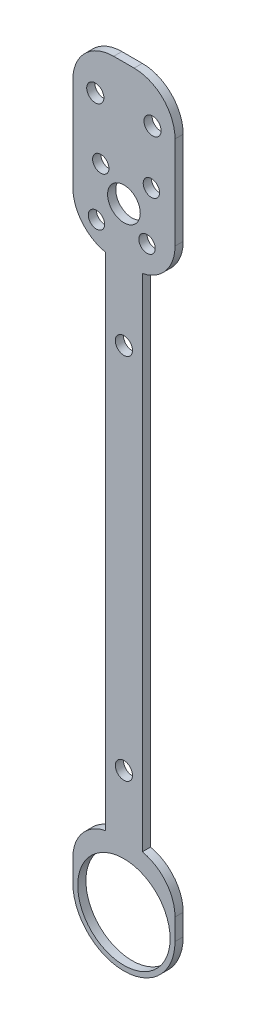
ISO-10303-21;
HEADER;
FILE_DESCRIPTION(('STEP AP214'),'2;1');
FILE_NAME('part.step','',(''),(''),'','','');
FILE_SCHEMA(('AUTOMOTIVE_DESIGN { 1 0 10303 214 1 1 1 1 }'));
ENDSEC;
DATA;
#1=APPLICATION_CONTEXT('core data for automotive mechanical design processes');
#2=APPLICATION_PROTOCOL_DEFINITION('international standard','automotive_design',2000,#1);
#3=PRODUCT_CONTEXT('',#1,'mechanical');
#4=PRODUCT('Part','Part','',(#3));
#5=PRODUCT_RELATED_PRODUCT_CATEGORY('part','',(#4));
#6=PRODUCT_DEFINITION_FORMATION('','',#4);
#7=PRODUCT_DEFINITION_CONTEXT('part definition',#1,'design');
#8=PRODUCT_DEFINITION('design','',#6,#7);
#9=PRODUCT_DEFINITION_SHAPE('','',#8);
#10=(LENGTH_UNIT() NAMED_UNIT(*) SI_UNIT(.MILLI.,.METRE.));
#11=(NAMED_UNIT(*) PLANE_ANGLE_UNIT() SI_UNIT($,.RADIAN.));
#12=(NAMED_UNIT(*) SI_UNIT($,.STERADIAN.) SOLID_ANGLE_UNIT());
#13=UNCERTAINTY_MEASURE_WITH_UNIT(LENGTH_MEASURE(1.E-05),#10,'distance_accuracy_value','');
#14=(GEOMETRIC_REPRESENTATION_CONTEXT(3) GLOBAL_UNCERTAINTY_ASSIGNED_CONTEXT((#13)) GLOBAL_UNIT_ASSIGNED_CONTEXT((#10,
#11,#12)) REPRESENTATION_CONTEXT('',''));
#15=CARTESIAN_POINT('',(0.,0.,0.));
#16=DIRECTION('',(0.,0.,1.));
#17=DIRECTION('',(1.,0.,0.));
#18=AXIS2_PLACEMENT_3D('',#15,#16,#17);
#19=CARTESIAN_POINT('',(0.,0.,2.));
#20=DIRECTION('',(0.,0.,1.));
#21=DIRECTION('',(1.,0.,0.));
#22=AXIS2_PLACEMENT_3D('',#19,#20,#21);
#23=PLANE('',#22);
#24=CARTESIAN_POINT('',(19.2175144212722,156.717514421272,2.));
#25=DIRECTION('',(0.,0.,1.));
#26=DIRECTION('',(1.,0.,0.));
#27=AXIS2_PLACEMENT_3D('',#24,#25,#26);
#28=CIRCLE('',#27,2.);
#29=CARTESIAN_POINT('',(21.2175144212722,156.717514421272,2.));
#30=VERTEX_POINT('',#29);
#31=EDGE_CURVE('E251',#30,#30,#28,.T.);
#32=ORIENTED_EDGE('',*,*,#31,.F.);
#33=EDGE_LOOP('',(#32));
#34=FACE_BOUND('',#33,.T.);
#35=CARTESIAN_POINT('',(6.84314575050766,155.656854249492,2.));
#36=DIRECTION('',(0.,0.,1.));
#37=DIRECTION('',(1.,0.,0.));
#38=AXIS2_PLACEMENT_3D('',#35,#36,#37);
#39=CIRCLE('',#38,2.);
#40=CARTESIAN_POINT('',(8.84314575050766,155.656854249492,2.));
#41=VERTEX_POINT('',#40);
#42=EDGE_CURVE('E282',#41,#41,#39,.T.);
#43=ORIENTED_EDGE('',*,*,#42,.F.);
#44=EDGE_LOOP('',(#43));
#45=FACE_BOUND('',#44,.T.);
#46=CARTESIAN_POINT('',(5.78248557872778,143.282485578728,2.));
#47=DIRECTION('',(0.,0.,1.));
#48=DIRECTION('',(1.,0.,0.));
#49=AXIS2_PLACEMENT_3D('',#46,#47,#48);
#50=CIRCLE('',#49,2.);
#51=CARTESIAN_POINT('',(7.78248557872778,143.282485578728,2.));
#52=VERTEX_POINT('',#51);
#53=EDGE_CURVE('E279',#52,#52,#50,.T.);
#54=ORIENTED_EDGE('',*,*,#53,.F.);
#55=EDGE_LOOP('',(#54));
#56=FACE_BOUND('',#55,.T.);
#57=CARTESIAN_POINT('',(18.1568542494924,144.343145750508,2.));
#58=DIRECTION('',(0.,0.,1.));
#59=DIRECTION('',(1.,0.,0.));
#60=AXIS2_PLACEMENT_3D('',#57,#58,#59);
#61=CIRCLE('',#60,2.00000000000001);
#62=CARTESIAN_POINT('',(20.1568542494924,144.343145750508,2.));
#63=VERTEX_POINT('',#62);
#64=EDGE_CURVE('E276',#63,#63,#61,.T.);
#65=ORIENTED_EDGE('',*,*,#64,.F.);
#66=EDGE_LOOP('',(#65));
#67=FACE_BOUND('',#66,.T.);
#68=DIRECTION('',(0.,1.,0.));
#69=VECTOR('',#68,1.);
#70=CARTESIAN_POINT('',(25.0000000000001,0.,2.));
#71=LINE('',#70,#69);
#72=CARTESIAN_POINT('',(25.0000000000001,0.,2.));
#73=VERTEX_POINT('',#72);
#74=CARTESIAN_POINT('',(25.0000000000001,5.2020410288673,2.));
#75=VERTEX_POINT('',#74);
#76=EDGE_CURVE('E138',#73,#75,#71,.T.);
#77=ORIENTED_EDGE('',*,*,#76,.T.);
#78=CARTESIAN_POINT('',(15.0000000000001,5.2020410288673,2.));
#79=DIRECTION('',(0.,0.,1.));
#80=DIRECTION('',(1.,0.,0.));
#81=AXIS2_PLACEMENT_3D('',#78,#79,#80);
#82=CIRCLE('',#81,10.);
#83=CARTESIAN_POINT('',(17.,15.,2.));
#84=VERTEX_POINT('',#83);
#85=EDGE_CURVE('E189',#75,#84,#82,.T.);
#86=ORIENTED_EDGE('',*,*,#85,.T.);
#87=DIRECTION('',(0.,-1.,0.));
#88=VECTOR('',#87,1.);
#89=CARTESIAN_POINT('',(17.0000000000001,0.,2.));
#90=LINE('',#89,#88);
#91=CARTESIAN_POINT('',(17.,137.5,2.));
#92=VERTEX_POINT('',#91);
#93=EDGE_CURVE('E148',#92,#84,#90,.T.);
#94=ORIENTED_EDGE('',*,*,#93,.F.);
#95=CARTESIAN_POINT('',(15.,147.297958971133,2.));
#96=DIRECTION('',(0.,0.,1.));
#97=DIRECTION('',(1.,0.,0.));
#98=AXIS2_PLACEMENT_3D('',#95,#96,#97);
#99=CIRCLE('',#98,10.);
#100=CARTESIAN_POINT('',(25.,147.297958971133,2.));
#101=VERTEX_POINT('',#100);
#102=EDGE_CURVE('E186',#92,#101,#99,.T.);
#103=ORIENTED_EDGE('',*,*,#102,.T.);
#104=CARTESIAN_POINT('',(25.,170.,2.));
#105=VERTEX_POINT('',#104);
#106=EDGE_CURVE('E151',#101,#105,#71,.T.);
#107=ORIENTED_EDGE('',*,*,#106,.T.);
#108=CARTESIAN_POINT('',(15.,170.,2.));
#109=DIRECTION('',(0.,0.,1.));
#110=DIRECTION('',(1.,0.,0.));
#111=AXIS2_PLACEMENT_3D('',#108,#109,#110);
#112=CIRCLE('',#111,10.);
#113=CARTESIAN_POINT('',(15.,180.,2.));
#114=VERTEX_POINT('',#113);
#115=EDGE_CURVE('E181',#105,#114,#112,.T.);
#116=ORIENTED_EDGE('',*,*,#115,.T.);
#117=DIRECTION('',(-1.,0.,0.));
#118=VECTOR('',#117,1.);
#119=CARTESIAN_POINT('',(0.,180.,2.));
#120=LINE('',#119,#118);
#121=CARTESIAN_POINT('',(9.99999999999997,180.,2.));
#122=VERTEX_POINT('',#121);
#123=EDGE_CURVE('E212',#114,#122,#120,.T.);
#124=ORIENTED_EDGE('',*,*,#123,.T.);
#125=CARTESIAN_POINT('',(9.99999999999997,170.,2.));
#126=DIRECTION('',(0.,0.,1.));
#127=DIRECTION('',(1.,0.,0.));
#128=AXIS2_PLACEMENT_3D('',#125,#126,#127);
#129=CIRCLE('',#128,10.);
#130=CARTESIAN_POINT('',(0.,170.,2.));
#131=VERTEX_POINT('',#130);
#132=EDGE_CURVE('E58',#122,#131,#129,.T.);
#133=ORIENTED_EDGE('',*,*,#132,.T.);
#134=DIRECTION('',(0.,1.,0.));
#135=VECTOR('',#134,1.);
#136=CARTESIAN_POINT('',(0.,0.,2.));
#137=LINE('',#136,#135);
#138=CARTESIAN_POINT('',(0.,147.297958971133,2.));
#139=VERTEX_POINT('',#138);
#140=EDGE_CURVE('E272',#139,#131,#137,.T.);
#141=ORIENTED_EDGE('',*,*,#140,.F.);
#142=CARTESIAN_POINT('',(9.99999999999998,147.297958971133,2.));
#143=DIRECTION('',(0.,0.,1.));
#144=DIRECTION('',(1.,0.,0.));
#145=AXIS2_PLACEMENT_3D('',#142,#143,#144);
#146=CIRCLE('',#145,10.);
#147=CARTESIAN_POINT('',(7.99999999999998,137.5,2.));
#148=VERTEX_POINT('',#147);
#149=EDGE_CURVE('E184',#139,#148,#146,.T.);
#150=ORIENTED_EDGE('',*,*,#149,.T.);
#151=DIRECTION('',(0.,-1.,0.));
#152=VECTOR('',#151,1.);
#153=CARTESIAN_POINT('',(7.99999999999999,0.,2.));
#154=LINE('',#153,#152);
#155=CARTESIAN_POINT('',(7.99999999999999,15.,2.));
#156=VERTEX_POINT('',#155);
#157=EDGE_CURVE('E274',#148,#156,#154,.T.);
#158=ORIENTED_EDGE('',*,*,#157,.T.);
#159=CARTESIAN_POINT('',(10.,5.2020410288673,2.));
#160=DIRECTION('',(0.,0.,1.));
#161=DIRECTION('',(1.,0.,0.));
#162=AXIS2_PLACEMENT_3D('',#159,#160,#161);
#163=CIRCLE('',#162,10.);
#164=CARTESIAN_POINT('',(0.,5.2020410288673,2.));
#165=VERTEX_POINT('',#164);
#166=EDGE_CURVE('E51',#156,#165,#163,.T.);
#167=ORIENTED_EDGE('',*,*,#166,.T.);
#168=CARTESIAN_POINT('',(0.,0.,2.));
#169=VERTEX_POINT('',#168);
#170=EDGE_CURVE('E154',#169,#165,#137,.T.);
#171=ORIENTED_EDGE('',*,*,#170,.F.);
#172=CARTESIAN_POINT('',(12.5,0.,2.));
#173=DIRECTION('',(0.,0.,1.));
#174=DIRECTION('',(1.,0.,0.));
#175=AXIS2_PLACEMENT_3D('',#172,#173,#174);
#176=CIRCLE('',#175,12.5);
#177=EDGE_CURVE('E149',#169,#73,#176,.T.);
#178=ORIENTED_EDGE('',*,*,#177,.T.);
#179=EDGE_LOOP('',(#77,#86,#94,#103,#107,#116,#124,#133,#141,#150,#158,#167,#171,#178));
#180=FACE_BOUND('',#179,.T.);
#181=CARTESIAN_POINT('',(12.5,0.,2.));
#182=DIRECTION('',(0.,0.,1.));
#183=DIRECTION('',(1.,0.,0.));
#184=AXIS2_PLACEMENT_3D('',#181,#182,#183);
#185=CIRCLE('',#184,11.3);
#186=CARTESIAN_POINT('',(23.8,0.,2.));
#187=VERTEX_POINT('',#186);
#188=EDGE_CURVE('E156',#187,#187,#185,.T.);
#189=ORIENTED_EDGE('',*,*,#188,.F.);
#190=EDGE_LOOP('',(#189));
#191=FACE_BOUND('',#190,.T.);
#192=CARTESIAN_POINT('',(12.5,150.,2.));
#193=DIRECTION('',(0.,0.,1.));
#194=DIRECTION('',(1.,0.,0.));
#195=AXIS2_PLACEMENT_3D('',#192,#193,#194);
#196=CIRCLE('',#195,4.);
#197=CARTESIAN_POINT('',(16.5,150.,2.));
#198=VERTEX_POINT('',#197);
#199=EDGE_CURVE('E247',#198,#198,#196,.T.);
#200=ORIENTED_EDGE('',*,*,#199,.F.);
#201=EDGE_LOOP('',(#200));
#202=FACE_BOUND('',#201,.T.);
#203=CARTESIAN_POINT('',(12.5,120.,2.));
#204=DIRECTION('',(0.,0.,-1.));
#205=DIRECTION('',(-1.,0.,0.));
#206=AXIS2_PLACEMENT_3D('',#203,#204,#205);
#207=CIRCLE('',#206,2.1);
#208=CARTESIAN_POINT('',(10.4,120.,2.));
#209=VERTEX_POINT('',#208);
#210=EDGE_CURVE('E291',#209,#209,#207,.T.);
#211=ORIENTED_EDGE('',*,*,#210,.T.);
#212=EDGE_LOOP('',(#211));
#213=FACE_BOUND('',#212,.T.);
#214=CARTESIAN_POINT('',(12.5,30.,2.));
#215=DIRECTION('',(0.,0.,-1.));
#216=DIRECTION('',(-1.,0.,0.));
#217=AXIS2_PLACEMENT_3D('',#214,#215,#216);
#218=CIRCLE('',#217,2.1);
#219=CARTESIAN_POINT('',(10.4,30.,2.));
#220=VERTEX_POINT('',#219);
#221=EDGE_CURVE('E405',#220,#220,#218,.T.);
#222=ORIENTED_EDGE('',*,*,#221,.T.);
#223=EDGE_LOOP('',(#222));
#224=FACE_BOUND('',#223,.T.);
#225=CARTESIAN_POINT('',(19.5,170.,2.));
#226=DIRECTION('',(0.,0.,-1.));
#227=DIRECTION('',(-1.,0.,0.));
#228=AXIS2_PLACEMENT_3D('',#225,#226,#227);
#229=CIRCLE('',#228,2.09999999999999);
#230=CARTESIAN_POINT('',(17.4,170.,2.));
#231=VERTEX_POINT('',#230);
#232=EDGE_CURVE('E376',#231,#231,#229,.T.);
#233=ORIENTED_EDGE('',*,*,#232,.T.);
#234=EDGE_LOOP('',(#233));
#235=FACE_BOUND('',#234,.T.);
#236=CARTESIAN_POINT('',(5.49999999999998,170.,2.));
#237=DIRECTION('',(0.,0.,1.));
#238=DIRECTION('',(1.,0.,0.));
#239=AXIS2_PLACEMENT_3D('',#236,#237,#238);
#240=CIRCLE('',#239,2.09999999999999);
#241=CARTESIAN_POINT('',(7.59999999999997,170.,2.));
#242=VERTEX_POINT('',#241);
#243=EDGE_CURVE('E377',#242,#242,#240,.T.);
#244=ORIENTED_EDGE('',*,*,#243,.F.);
#245=EDGE_LOOP('',(#244));
#246=FACE_BOUND('',#245,.T.);
#247=ADVANCED_FACE('F36',(#34,#45,#56,#67,#180,#191,#202,#213,#224,#235,#246),#23,.T.);
#248=CARTESIAN_POINT('',(0.,0.,0.));
#249=DIRECTION('',(0.,0.,1.));
#250=DIRECTION('',(1.,0.,0.));
#251=AXIS2_PLACEMENT_3D('',#248,#249,#250);
#252=PLANE('',#251);
#253=CARTESIAN_POINT('',(19.5,170.,0.));
#254=DIRECTION('',(0.,0.,-1.));
#255=DIRECTION('',(-1.,0.,0.));
#256=AXIS2_PLACEMENT_3D('',#253,#254,#255);
#257=CIRCLE('',#256,2.09999999999999);
#258=CARTESIAN_POINT('',(17.4,170.,0.));
#259=VERTEX_POINT('',#258);
#260=EDGE_CURVE('E380',#259,#259,#257,.T.);
#261=ORIENTED_EDGE('',*,*,#260,.F.);
#262=EDGE_LOOP('',(#261));
#263=FACE_BOUND('',#262,.T.);
#264=CARTESIAN_POINT('',(12.5,30.,0.));
#265=DIRECTION('',(0.,0.,-1.));
#266=DIRECTION('',(-1.,0.,0.));
#267=AXIS2_PLACEMENT_3D('',#264,#265,#266);
#268=CIRCLE('',#267,2.1);
#269=CARTESIAN_POINT('',(10.4,30.,0.));
#270=VERTEX_POINT('',#269);
#271=EDGE_CURVE('E391',#270,#270,#268,.T.);
#272=ORIENTED_EDGE('',*,*,#271,.F.);
#273=EDGE_LOOP('',(#272));
#274=FACE_BOUND('',#273,.T.);
#275=CARTESIAN_POINT('',(12.5,120.,0.));
#276=DIRECTION('',(0.,0.,-1.));
#277=DIRECTION('',(-1.,0.,0.));
#278=AXIS2_PLACEMENT_3D('',#275,#276,#277);
#279=CIRCLE('',#278,2.1);
#280=CARTESIAN_POINT('',(10.4,120.,0.));
#281=VERTEX_POINT('',#280);
#282=EDGE_CURVE('E388',#281,#281,#279,.T.);
#283=ORIENTED_EDGE('',*,*,#282,.F.);
#284=EDGE_LOOP('',(#283));
#285=FACE_BOUND('',#284,.T.);
#286=CARTESIAN_POINT('',(12.5,150.,0.));
#287=DIRECTION('',(0.,0.,1.));
#288=DIRECTION('',(1.,0.,0.));
#289=AXIS2_PLACEMENT_3D('',#286,#287,#288);
#290=CIRCLE('',#289,4.);
#291=CARTESIAN_POINT('',(16.5,150.,0.));
#292=VERTEX_POINT('',#291);
#293=EDGE_CURVE('E287',#292,#292,#290,.T.);
#294=ORIENTED_EDGE('',*,*,#293,.T.);
#295=EDGE_LOOP('',(#294));
#296=FACE_BOUND('',#295,.T.);
#297=CARTESIAN_POINT('',(12.5,0.,0.));
#298=DIRECTION('',(0.,0.,1.));
#299=DIRECTION('',(1.,0.,0.));
#300=AXIS2_PLACEMENT_3D('',#297,#298,#299);
#301=CIRCLE('',#300,11.3);
#302=CARTESIAN_POINT('',(23.8,0.,0.));
#303=VERTEX_POINT('',#302);
#304=EDGE_CURVE('E290',#303,#303,#301,.T.);
#305=ORIENTED_EDGE('',*,*,#304,.T.);
#306=EDGE_LOOP('',(#305));
#307=FACE_BOUND('',#306,.T.);
#308=DIRECTION('',(0.,-1.,0.));
#309=VECTOR('',#308,1.);
#310=CARTESIAN_POINT('',(17.0000000000001,0.,0.));
#311=LINE('',#310,#309);
#312=CARTESIAN_POINT('',(17.,137.5,0.));
#313=VERTEX_POINT('',#312);
#314=CARTESIAN_POINT('',(17.,15.,0.));
#315=VERTEX_POINT('',#314);
#316=EDGE_CURVE('E228',#313,#315,#311,.T.);
#317=ORIENTED_EDGE('',*,*,#316,.T.);
#318=CARTESIAN_POINT('',(15.0000000000001,5.2020410288673,0.));
#319=DIRECTION('',(0.,0.,1.));
#320=DIRECTION('',(1.,0.,0.));
#321=AXIS2_PLACEMENT_3D('',#318,#319,#320);
#322=CIRCLE('',#321,10.);
#323=CARTESIAN_POINT('',(25.0000000000001,5.2020410288673,0.));
#324=VERTEX_POINT('',#323);
#325=EDGE_CURVE('E178',#315,#324,#322,.F.);
#326=ORIENTED_EDGE('',*,*,#325,.T.);
#327=DIRECTION('',(0.,1.,0.));
#328=VECTOR('',#327,1.);
#329=CARTESIAN_POINT('',(25.0000000000001,0.,0.));
#330=LINE('',#329,#328);
#331=CARTESIAN_POINT('',(25.0000000000001,0.,0.));
#332=VERTEX_POINT('',#331);
#333=EDGE_CURVE('E230',#332,#324,#330,.T.);
#334=ORIENTED_EDGE('',*,*,#333,.F.);
#335=CARTESIAN_POINT('',(12.5,0.,0.));
#336=DIRECTION('',(0.,0.,1.));
#337=DIRECTION('',(1.,0.,0.));
#338=AXIS2_PLACEMENT_3D('',#335,#336,#337);
#339=CIRCLE('',#338,12.5);
#340=CARTESIAN_POINT('',(0.,0.,0.));
#341=VERTEX_POINT('',#340);
#342=EDGE_CURVE('E160',#341,#332,#339,.T.);
#343=ORIENTED_EDGE('',*,*,#342,.F.);
#344=DIRECTION('',(0.,1.,0.));
#345=VECTOR('',#344,1.);
#346=CARTESIAN_POINT('',(0.,0.,0.));
#347=LINE('',#346,#345);
#348=CARTESIAN_POINT('',(0.,5.2020410288673,0.));
#349=VERTEX_POINT('',#348);
#350=EDGE_CURVE('E227',#341,#349,#347,.T.);
#351=ORIENTED_EDGE('',*,*,#350,.T.);
#352=CARTESIAN_POINT('',(10.,5.2020410288673,0.));
#353=DIRECTION('',(0.,0.,1.));
#354=DIRECTION('',(1.,0.,0.));
#355=AXIS2_PLACEMENT_3D('',#352,#353,#354);
#356=CIRCLE('',#355,10.);
#357=CARTESIAN_POINT('',(7.99999999999999,15.,0.));
#358=VERTEX_POINT('',#357);
#359=EDGE_CURVE('E176',#349,#358,#356,.F.);
#360=ORIENTED_EDGE('',*,*,#359,.T.);
#361=DIRECTION('',(0.,-1.,0.));
#362=VECTOR('',#361,1.);
#363=CARTESIAN_POINT('',(7.99999999999999,0.,0.));
#364=LINE('',#363,#362);
#365=CARTESIAN_POINT('',(7.99999999999998,137.5,0.));
#366=VERTEX_POINT('',#365);
#367=EDGE_CURVE('E225',#366,#358,#364,.T.);
#368=ORIENTED_EDGE('',*,*,#367,.F.);
#369=CARTESIAN_POINT('',(9.99999999999998,147.297958971133,0.));
#370=DIRECTION('',(0.,0.,1.));
#371=DIRECTION('',(1.,0.,0.));
#372=AXIS2_PLACEMENT_3D('',#369,#370,#371);
#373=CIRCLE('',#372,10.);
#374=CARTESIAN_POINT('',(0.,147.297958971133,0.));
#375=VERTEX_POINT('',#374);
#376=EDGE_CURVE('E172',#366,#375,#373,.F.);
#377=ORIENTED_EDGE('',*,*,#376,.T.);
#378=CARTESIAN_POINT('',(0.,170.,0.));
#379=VERTEX_POINT('',#378);
#380=EDGE_CURVE('E222',#375,#379,#347,.T.);
#381=ORIENTED_EDGE('',*,*,#380,.T.);
#382=CARTESIAN_POINT('',(9.99999999999997,170.,0.));
#383=DIRECTION('',(0.,0.,1.));
#384=DIRECTION('',(1.,0.,0.));
#385=AXIS2_PLACEMENT_3D('',#382,#383,#384);
#386=CIRCLE('',#385,10.);
#387=CARTESIAN_POINT('',(9.99999999999997,180.,0.));
#388=VERTEX_POINT('',#387);
#389=EDGE_CURVE('E164',#379,#388,#386,.F.);
#390=ORIENTED_EDGE('',*,*,#389,.T.);
#391=DIRECTION('',(-1.,0.,0.));
#392=VECTOR('',#391,1.);
#393=CARTESIAN_POINT('',(0.,180.,0.));
#394=LINE('',#393,#392);
#395=CARTESIAN_POINT('',(15.,180.,0.));
#396=VERTEX_POINT('',#395);
#397=EDGE_CURVE('E210',#396,#388,#394,.T.);
#398=ORIENTED_EDGE('',*,*,#397,.F.);
#399=CARTESIAN_POINT('',(15.,170.,0.));
#400=DIRECTION('',(0.,0.,1.));
#401=DIRECTION('',(1.,0.,0.));
#402=AXIS2_PLACEMENT_3D('',#399,#400,#401);
#403=CIRCLE('',#402,10.);
#404=CARTESIAN_POINT('',(25.,170.,0.));
#405=VERTEX_POINT('',#404);
#406=EDGE_CURVE('E161',#396,#405,#403,.F.);
#407=ORIENTED_EDGE('',*,*,#406,.T.);
#408=CARTESIAN_POINT('',(25.,147.297958971133,0.));
#409=VERTEX_POINT('',#408);
#410=EDGE_CURVE('E223',#409,#405,#330,.T.);
#411=ORIENTED_EDGE('',*,*,#410,.F.);
#412=CARTESIAN_POINT('',(15.,147.297958971133,0.));
#413=DIRECTION('',(0.,0.,1.));
#414=DIRECTION('',(1.,0.,0.));
#415=AXIS2_PLACEMENT_3D('',#412,#413,#414);
#416=CIRCLE('',#415,10.);
#417=EDGE_CURVE('E174',#409,#313,#416,.F.);
#418=ORIENTED_EDGE('',*,*,#417,.T.);
#419=EDGE_LOOP('',(#317,#326,#334,#343,#351,#360,#368,#377,#381,#390,#398,#407,#411,#418));
#420=FACE_BOUND('',#419,.T.);
#421=CARTESIAN_POINT('',(18.1568542494924,144.343145750508,0.));
#422=DIRECTION('',(0.,0.,1.));
#423=DIRECTION('',(1.,0.,0.));
#424=AXIS2_PLACEMENT_3D('',#421,#422,#423);
#425=CIRCLE('',#424,2.00000000000001);
#426=CARTESIAN_POINT('',(20.1568542494924,144.343145750508,0.));
#427=VERTEX_POINT('',#426);
#428=EDGE_CURVE('E235',#427,#427,#425,.T.);
#429=ORIENTED_EDGE('',*,*,#428,.T.);
#430=EDGE_LOOP('',(#429));
#431=FACE_BOUND('',#430,.T.);
#432=CARTESIAN_POINT('',(5.78248557872778,143.282485578728,0.));
#433=DIRECTION('',(0.,0.,1.));
#434=DIRECTION('',(1.,0.,0.));
#435=AXIS2_PLACEMENT_3D('',#432,#433,#434);
#436=CIRCLE('',#435,2.);
#437=CARTESIAN_POINT('',(7.78248557872778,143.282485578728,0.));
#438=VERTEX_POINT('',#437);
#439=EDGE_CURVE('E238',#438,#438,#436,.T.);
#440=ORIENTED_EDGE('',*,*,#439,.T.);
#441=EDGE_LOOP('',(#440));
#442=FACE_BOUND('',#441,.T.);
#443=CARTESIAN_POINT('',(6.84314575050766,155.656854249492,0.));
#444=DIRECTION('',(0.,0.,1.));
#445=DIRECTION('',(1.,0.,0.));
#446=AXIS2_PLACEMENT_3D('',#443,#444,#445);
#447=CIRCLE('',#446,2.);
#448=CARTESIAN_POINT('',(8.84314575050766,155.656854249492,0.));
#449=VERTEX_POINT('',#448);
#450=EDGE_CURVE('E241',#449,#449,#447,.T.);
#451=ORIENTED_EDGE('',*,*,#450,.T.);
#452=EDGE_LOOP('',(#451));
#453=FACE_BOUND('',#452,.T.);
#454=CARTESIAN_POINT('',(19.2175144212722,156.717514421272,0.));
#455=DIRECTION('',(0.,0.,1.));
#456=DIRECTION('',(1.,0.,0.));
#457=AXIS2_PLACEMENT_3D('',#454,#455,#456);
#458=CIRCLE('',#457,2.);
#459=CARTESIAN_POINT('',(21.2175144212722,156.717514421272,0.));
#460=VERTEX_POINT('',#459);
#461=EDGE_CURVE('E244',#460,#460,#458,.T.);
#462=ORIENTED_EDGE('',*,*,#461,.T.);
#463=EDGE_LOOP('',(#462));
#464=FACE_BOUND('',#463,.T.);
#465=CARTESIAN_POINT('',(5.49999999999998,170.,0.));
#466=DIRECTION('',(0.,0.,1.));
#467=DIRECTION('',(1.,0.,0.));
#468=AXIS2_PLACEMENT_3D('',#465,#466,#467);
#469=CIRCLE('',#468,2.09999999999999);
#470=CARTESIAN_POINT('',(7.59999999999997,170.,0.));
#471=VERTEX_POINT('',#470);
#472=EDGE_CURVE('E374',#471,#471,#469,.T.);
#473=ORIENTED_EDGE('',*,*,#472,.T.);
#474=EDGE_LOOP('',(#473));
#475=FACE_BOUND('',#474,.T.);
#476=ADVANCED_FACE('F217',(#263,#274,#285,#296,#307,#420,#431,#442,#453,#464,#475),#252,.F.);
#477=CARTESIAN_POINT('',(12.5,0.,2.));
#478=DIRECTION('',(0.,0.,-1.));
#479=DIRECTION('',(-1.,0.,0.));
#480=AXIS2_PLACEMENT_3D('',#477,#478,#479);
#481=CYLINDRICAL_SURFACE('',#480,12.5);
#482=ORIENTED_EDGE('',*,*,#342,.T.);
#483=DIRECTION('',(0.,0.,-1.));
#484=VECTOR('',#483,1.);
#485=CARTESIAN_POINT('',(25.0000000000001,0.,2.));
#486=LINE('',#485,#484);
#487=EDGE_CURVE('E143',#73,#332,#486,.T.);
#488=ORIENTED_EDGE('',*,*,#487,.F.);
#489=ORIENTED_EDGE('',*,*,#177,.F.);
#490=DIRECTION('',(0.,0.,-1.));
#491=VECTOR('',#490,1.);
#492=CARTESIAN_POINT('',(0.,0.,2.));
#493=LINE('',#492,#491);
#494=EDGE_CURVE('E248',#169,#341,#493,.T.);
#495=ORIENTED_EDGE('',*,*,#494,.T.);
#496=EDGE_LOOP('',(#482,#488,#489,#495));
#497=FACE_BOUND('',#496,.T.);
#498=ADVANCED_FACE('F158',(#497),#481,.T.);
#499=CARTESIAN_POINT('',(25.0000000000001,0.,2.));
#500=DIRECTION('',(-1.,0.,0.));
#501=DIRECTION('',(0.,-1.,0.));
#502=AXIS2_PLACEMENT_3D('',#499,#500,#501);
#503=PLANE('',#502);
#504=ORIENTED_EDGE('',*,*,#333,.T.);
#505=DIRECTION('',(0.,0.,1.));
#506=VECTOR('',#505,1.);
#507=CARTESIAN_POINT('',(25.0000000000001,5.2020410288673,2.));
#508=LINE('',#507,#506);
#509=EDGE_CURVE('E146',#324,#75,#508,.T.);
#510=ORIENTED_EDGE('',*,*,#509,.T.);
#511=ORIENTED_EDGE('',*,*,#76,.F.);
#512=ORIENTED_EDGE('',*,*,#487,.T.);
#513=EDGE_LOOP('',(#504,#510,#511,#512));
#514=FACE_BOUND('',#513,.T.);
#515=ADVANCED_FACE('F141',(#514),#503,.F.);
#516=CARTESIAN_POINT('',(17.0000000000001,0.,2.));
#517=DIRECTION('',(1.,0.,0.));
#518=DIRECTION('',(0.,1.,0.));
#519=AXIS2_PLACEMENT_3D('',#516,#517,#518);
#520=PLANE('',#519);
#521=ORIENTED_EDGE('',*,*,#316,.F.);
#522=DIRECTION('',(0.,0.,-1.));
#523=VECTOR('',#522,1.);
#524=CARTESIAN_POINT('',(17.,137.5,2.));
#525=LINE('',#524,#523);
#526=EDGE_CURVE('E167',#92,#313,#525,.T.);
#527=ORIENTED_EDGE('',*,*,#526,.F.);
#528=ORIENTED_EDGE('',*,*,#93,.T.);
#529=DIRECTION('',(0.,0.,-1.));
#530=VECTOR('',#529,1.);
#531=CARTESIAN_POINT('',(17.,15.,2.));
#532=LINE('',#531,#530);
#533=EDGE_CURVE('E162',#84,#315,#532,.T.);
#534=ORIENTED_EDGE('',*,*,#533,.T.);
#535=EDGE_LOOP('',(#521,#527,#528,#534));
#536=FACE_BOUND('',#535,.T.);
#537=ADVANCED_FACE('F265',(#536),#520,.T.);
#538=ORIENTED_EDGE('',*,*,#106,.F.);
#539=DIRECTION('',(0.,0.,1.));
#540=VECTOR('',#539,1.);
#541=CARTESIAN_POINT('',(25.,147.297958971133,2.));
#542=LINE('',#541,#540);
#543=EDGE_CURVE('E196',#101,#409,#542,.F.);
#544=ORIENTED_EDGE('',*,*,#543,.T.);
#545=ORIENTED_EDGE('',*,*,#410,.T.);
#546=DIRECTION('',(0.,0.,-1.));
#547=VECTOR('',#546,1.);
#548=CARTESIAN_POINT('',(25.,170.,2.));
#549=LINE('',#548,#547);
#550=EDGE_CURVE('E194',#405,#105,#549,.F.);
#551=ORIENTED_EDGE('',*,*,#550,.T.);
#552=EDGE_LOOP('',(#538,#544,#545,#551));
#553=FACE_BOUND('',#552,.T.);
#554=ADVANCED_FACE('F296',(#553),#503,.F.);
#555=CARTESIAN_POINT('',(0.,180.,2.));
#556=DIRECTION('',(0.,-1.,0.));
#557=DIRECTION('',(0.,0.,-1.));
#558=AXIS2_PLACEMENT_3D('',#555,#556,#557);
#559=PLANE('',#558);
#560=ORIENTED_EDGE('',*,*,#397,.T.);
#561=DIRECTION('',(0.,0.,-1.));
#562=VECTOR('',#561,1.);
#563=CARTESIAN_POINT('',(9.99999999999997,180.,2.));
#564=LINE('',#563,#562);
#565=EDGE_CURVE('E11',#388,#122,#564,.F.);
#566=ORIENTED_EDGE('',*,*,#565,.T.);
#567=ORIENTED_EDGE('',*,*,#123,.F.);
#568=DIRECTION('',(0.,0.,-1.));
#569=VECTOR('',#568,1.);
#570=CARTESIAN_POINT('',(15.,180.,2.));
#571=LINE('',#570,#569);
#572=EDGE_CURVE('E44',#114,#396,#571,.T.);
#573=ORIENTED_EDGE('',*,*,#572,.T.);
#574=EDGE_LOOP('',(#560,#566,#567,#573));
#575=FACE_BOUND('',#574,.T.);
#576=ADVANCED_FACE('F209',(#575),#559,.F.);
#577=CARTESIAN_POINT('',(0.,0.,2.));
#578=DIRECTION('',(-1.,0.,0.));
#579=DIRECTION('',(0.,-1.,0.));
#580=AXIS2_PLACEMENT_3D('',#577,#578,#579);
#581=PLANE('',#580);
#582=ORIENTED_EDGE('',*,*,#380,.F.);
#583=DIRECTION('',(0.,0.,1.));
#584=VECTOR('',#583,1.);
#585=CARTESIAN_POINT('',(0.,147.297958971133,2.));
#586=LINE('',#585,#584);
#587=EDGE_CURVE('E202',#375,#139,#586,.T.);
#588=ORIENTED_EDGE('',*,*,#587,.T.);
#589=ORIENTED_EDGE('',*,*,#140,.T.);
#590=DIRECTION('',(0.,0.,-1.));
#591=VECTOR('',#590,1.);
#592=CARTESIAN_POINT('',(0.,170.,0.));
#593=LINE('',#592,#591);
#594=EDGE_CURVE('E199',#131,#379,#593,.T.);
#595=ORIENTED_EDGE('',*,*,#594,.T.);
#596=EDGE_LOOP('',(#582,#588,#589,#595));
#597=FACE_BOUND('',#596,.T.);
#598=ADVANCED_FACE('F302',(#597),#581,.T.);
#599=CARTESIAN_POINT('',(7.99999999999999,0.,2.));
#600=DIRECTION('',(1.,0.,0.));
#601=DIRECTION('',(0.,1.,0.));
#602=AXIS2_PLACEMENT_3D('',#599,#600,#601);
#603=PLANE('',#602);
#604=ORIENTED_EDGE('',*,*,#367,.T.);
#605=DIRECTION('',(0.,0.,-1.));
#606=VECTOR('',#605,1.);
#607=CARTESIAN_POINT('',(7.99999999999999,15.,2.));
#608=LINE('',#607,#606);
#609=EDGE_CURVE('E250',#156,#358,#608,.T.);
#610=ORIENTED_EDGE('',*,*,#609,.F.);
#611=ORIENTED_EDGE('',*,*,#157,.F.);
#612=DIRECTION('',(0.,0.,-1.));
#613=VECTOR('',#612,1.);
#614=CARTESIAN_POINT('',(7.99999999999998,137.5,2.));
#615=LINE('',#614,#613);
#616=EDGE_CURVE('E254',#148,#366,#615,.T.);
#617=ORIENTED_EDGE('',*,*,#616,.T.);
#618=EDGE_LOOP('',(#604,#610,#611,#617));
#619=FACE_BOUND('',#618,.T.);
#620=ADVANCED_FACE('F311',(#619),#603,.F.);
#621=CARTESIAN_POINT('',(6.84314575050766,155.656854249492,2.));
#622=DIRECTION('',(0.,0.,-1.));
#623=DIRECTION('',(-1.,0.,0.));
#624=AXIS2_PLACEMENT_3D('',#621,#622,#623);
#625=CYLINDRICAL_SURFACE('',#624,2.);
#626=ORIENTED_EDGE('',*,*,#42,.T.);
#627=EDGE_LOOP('',(#626));
#628=FACE_BOUND('',#627,.T.);
#629=ORIENTED_EDGE('',*,*,#450,.F.);
#630=EDGE_LOOP('',(#629));
#631=FACE_BOUND('',#630,.T.);
#632=ADVANCED_FACE('F355',(#628,#631),#625,.F.);
#633=CARTESIAN_POINT('',(5.78248557872778,143.282485578728,2.));
#634=DIRECTION('',(0.,0.,-1.));
#635=DIRECTION('',(-1.,0.,0.));
#636=AXIS2_PLACEMENT_3D('',#633,#634,#635);
#637=CYLINDRICAL_SURFACE('',#636,2.);
#638=ORIENTED_EDGE('',*,*,#53,.T.);
#639=EDGE_LOOP('',(#638));
#640=FACE_BOUND('',#639,.T.);
#641=ORIENTED_EDGE('',*,*,#439,.F.);
#642=EDGE_LOOP('',(#641));
#643=FACE_BOUND('',#642,.T.);
#644=ADVANCED_FACE('F331',(#640,#643),#637,.F.);
#645=CARTESIAN_POINT('',(18.1568542494924,144.343145750508,2.));
#646=DIRECTION('',(0.,0.,-1.));
#647=DIRECTION('',(-1.,0.,0.));
#648=AXIS2_PLACEMENT_3D('',#645,#646,#647);
#649=CYLINDRICAL_SURFACE('',#648,2.00000000000001);
#650=ORIENTED_EDGE('',*,*,#64,.T.);
#651=EDGE_LOOP('',(#650));
#652=FACE_BOUND('',#651,.T.);
#653=ORIENTED_EDGE('',*,*,#428,.F.);
#654=EDGE_LOOP('',(#653));
#655=FACE_BOUND('',#654,.T.);
#656=ADVANCED_FACE('F322',(#652,#655),#649,.F.);
#657=ORIENTED_EDGE('',*,*,#170,.T.);
#658=DIRECTION('',(0.,0.,1.));
#659=VECTOR('',#658,1.);
#660=CARTESIAN_POINT('',(0.,5.2020410288673,0.));
#661=LINE('',#660,#659);
#662=EDGE_CURVE('E191',#165,#349,#661,.F.);
#663=ORIENTED_EDGE('',*,*,#662,.T.);
#664=ORIENTED_EDGE('',*,*,#350,.F.);
#665=ORIENTED_EDGE('',*,*,#494,.F.);
#666=EDGE_LOOP('',(#657,#663,#664,#665));
#667=FACE_BOUND('',#666,.T.);
#668=ADVANCED_FACE('F319',(#667),#581,.T.);
#669=CARTESIAN_POINT('',(12.5,0.,2.));
#670=DIRECTION('',(0.,0.,-1.));
#671=DIRECTION('',(-1.,0.,0.));
#672=AXIS2_PLACEMENT_3D('',#669,#670,#671);
#673=CYLINDRICAL_SURFACE('',#672,11.3);
#674=ORIENTED_EDGE('',*,*,#188,.T.);
#675=EDGE_LOOP('',(#674));
#676=FACE_BOUND('',#675,.T.);
#677=ORIENTED_EDGE('',*,*,#304,.F.);
#678=EDGE_LOOP('',(#677));
#679=FACE_BOUND('',#678,.T.);
#680=ADVANCED_FACE('F321',(#676,#679),#673,.F.);
#681=CARTESIAN_POINT('',(12.5,150.,2.));
#682=DIRECTION('',(0.,0.,-1.));
#683=DIRECTION('',(-1.,0.,0.));
#684=AXIS2_PLACEMENT_3D('',#681,#682,#683);
#685=CYLINDRICAL_SURFACE('',#684,4.);
#686=ORIENTED_EDGE('',*,*,#199,.T.);
#687=EDGE_LOOP('',(#686));
#688=FACE_BOUND('',#687,.T.);
#689=ORIENTED_EDGE('',*,*,#293,.F.);
#690=EDGE_LOOP('',(#689));
#691=FACE_BOUND('',#690,.T.);
#692=ADVANCED_FACE('F328',(#688,#691),#685,.F.);
#693=CARTESIAN_POINT('',(19.2175144212722,156.717514421272,2.));
#694=DIRECTION('',(0.,0.,-1.));
#695=DIRECTION('',(-1.,0.,0.));
#696=AXIS2_PLACEMENT_3D('',#693,#694,#695);
#697=CYLINDRICAL_SURFACE('',#696,2.);
#698=ORIENTED_EDGE('',*,*,#31,.T.);
#699=EDGE_LOOP('',(#698));
#700=FACE_BOUND('',#699,.T.);
#701=ORIENTED_EDGE('',*,*,#461,.F.);
#702=EDGE_LOOP('',(#701));
#703=FACE_BOUND('',#702,.T.);
#704=ADVANCED_FACE('F350',(#700,#703),#697,.F.);
#705=CARTESIAN_POINT('',(15.0000000000001,5.2020410288673,2.));
#706=DIRECTION('',(0.,0.,1.));
#707=DIRECTION('',(1.,0.,0.));
#708=AXIS2_PLACEMENT_3D('',#705,#706,#707);
#709=CYLINDRICAL_SURFACE('',#708,10.);
#710=ORIENTED_EDGE('',*,*,#85,.F.);
#711=ORIENTED_EDGE('',*,*,#509,.F.);
#712=ORIENTED_EDGE('',*,*,#325,.F.);
#713=ORIENTED_EDGE('',*,*,#533,.F.);
#714=EDGE_LOOP('',(#710,#711,#712,#713));
#715=FACE_BOUND('',#714,.T.);
#716=ADVANCED_FACE('F353',(#715),#709,.T.);
#717=CARTESIAN_POINT('',(10.,5.2020410288673,2.));
#718=DIRECTION('',(0.,0.,-1.));
#719=DIRECTION('',(-1.,0.,0.));
#720=AXIS2_PLACEMENT_3D('',#717,#718,#719);
#721=CYLINDRICAL_SURFACE('',#720,10.);
#722=ORIENTED_EDGE('',*,*,#166,.F.);
#723=ORIENTED_EDGE('',*,*,#609,.T.);
#724=ORIENTED_EDGE('',*,*,#359,.F.);
#725=ORIENTED_EDGE('',*,*,#662,.F.);
#726=EDGE_LOOP('',(#722,#723,#724,#725));
#727=FACE_BOUND('',#726,.T.);
#728=ADVANCED_FACE('F315',(#727),#721,.T.);
#729=CARTESIAN_POINT('',(15.,147.297958971133,2.));
#730=DIRECTION('',(0.,0.,1.));
#731=DIRECTION('',(1.,0.,0.));
#732=AXIS2_PLACEMENT_3D('',#729,#730,#731);
#733=CYLINDRICAL_SURFACE('',#732,10.);
#734=ORIENTED_EDGE('',*,*,#102,.F.);
#735=ORIENTED_EDGE('',*,*,#526,.T.);
#736=ORIENTED_EDGE('',*,*,#417,.F.);
#737=ORIENTED_EDGE('',*,*,#543,.F.);
#738=EDGE_LOOP('',(#734,#735,#736,#737));
#739=FACE_BOUND('',#738,.T.);
#740=ADVANCED_FACE('F259',(#739),#733,.T.);
#741=CARTESIAN_POINT('',(9.99999999999998,147.297958971133,2.));
#742=DIRECTION('',(0.,0.,-1.));
#743=DIRECTION('',(-1.,0.,0.));
#744=AXIS2_PLACEMENT_3D('',#741,#742,#743);
#745=CYLINDRICAL_SURFACE('',#744,10.);
#746=ORIENTED_EDGE('',*,*,#149,.F.);
#747=ORIENTED_EDGE('',*,*,#587,.F.);
#748=ORIENTED_EDGE('',*,*,#376,.F.);
#749=ORIENTED_EDGE('',*,*,#616,.F.);
#750=EDGE_LOOP('',(#746,#747,#748,#749));
#751=FACE_BOUND('',#750,.T.);
#752=ADVANCED_FACE('F308',(#751),#745,.T.);
#753=CARTESIAN_POINT('',(9.99999999999997,170.,2.));
#754=DIRECTION('',(0.,0.,1.));
#755=DIRECTION('',(1.,0.,0.));
#756=AXIS2_PLACEMENT_3D('',#753,#754,#755);
#757=CYLINDRICAL_SURFACE('',#756,10.);
#758=ORIENTED_EDGE('',*,*,#132,.F.);
#759=ORIENTED_EDGE('',*,*,#565,.F.);
#760=ORIENTED_EDGE('',*,*,#389,.F.);
#761=ORIENTED_EDGE('',*,*,#594,.F.);
#762=EDGE_LOOP('',(#758,#759,#760,#761));
#763=FACE_BOUND('',#762,.T.);
#764=ADVANCED_FACE('F299',(#763),#757,.T.);
#765=CARTESIAN_POINT('',(15.,170.,2.));
#766=DIRECTION('',(0.,0.,-1.));
#767=DIRECTION('',(-1.,0.,0.));
#768=AXIS2_PLACEMENT_3D('',#765,#766,#767);
#769=CYLINDRICAL_SURFACE('',#768,10.);
#770=ORIENTED_EDGE('',*,*,#115,.F.);
#771=ORIENTED_EDGE('',*,*,#550,.F.);
#772=ORIENTED_EDGE('',*,*,#406,.F.);
#773=ORIENTED_EDGE('',*,*,#572,.F.);
#774=EDGE_LOOP('',(#770,#771,#772,#773));
#775=FACE_BOUND('',#774,.T.);
#776=ADVANCED_FACE('F38',(#775),#769,.T.);
#777=CARTESIAN_POINT('',(12.5,120.,2.));
#778=DIRECTION('',(0.,0.,-1.));
#779=DIRECTION('',(-1.,0.,0.));
#780=AXIS2_PLACEMENT_3D('',#777,#778,#779);
#781=CYLINDRICAL_SURFACE('',#780,2.1);
#782=ORIENTED_EDGE('',*,*,#210,.F.);
#783=EDGE_LOOP('',(#782));
#784=FACE_BOUND('',#783,.T.);
#785=ORIENTED_EDGE('',*,*,#282,.T.);
#786=EDGE_LOOP('',(#785));
#787=FACE_BOUND('',#786,.T.);
#788=ADVANCED_FACE('F347',(#784,#787),#781,.F.);
#789=CARTESIAN_POINT('',(12.5,30.,2.));
#790=DIRECTION('',(0.,0.,-1.));
#791=DIRECTION('',(-1.,0.,0.));
#792=AXIS2_PLACEMENT_3D('',#789,#790,#791);
#793=CYLINDRICAL_SURFACE('',#792,2.1);
#794=ORIENTED_EDGE('',*,*,#221,.F.);
#795=EDGE_LOOP('',(#794));
#796=FACE_BOUND('',#795,.T.);
#797=ORIENTED_EDGE('',*,*,#271,.T.);
#798=EDGE_LOOP('',(#797));
#799=FACE_BOUND('',#798,.T.);
#800=ADVANCED_FACE('F416',(#796,#799),#793,.F.);
#801=CARTESIAN_POINT('',(19.5,170.,2.));
#802=DIRECTION('',(0.,0.,-1.));
#803=DIRECTION('',(-1.,0.,0.));
#804=AXIS2_PLACEMENT_3D('',#801,#802,#803);
#805=CYLINDRICAL_SURFACE('',#804,2.09999999999999);
#806=ORIENTED_EDGE('',*,*,#232,.F.);
#807=EDGE_LOOP('',(#806));
#808=FACE_BOUND('',#807,.T.);
#809=ORIENTED_EDGE('',*,*,#260,.T.);
#810=EDGE_LOOP('',(#809));
#811=FACE_BOUND('',#810,.T.);
#812=ADVANCED_FACE('F412',(#808,#811),#805,.F.);
#813=CARTESIAN_POINT('',(5.49999999999998,170.,2.));
#814=DIRECTION('',(0.,0.,-1.));
#815=DIRECTION('',(-1.,0.,0.));
#816=AXIS2_PLACEMENT_3D('',#813,#814,#815);
#817=CYLINDRICAL_SURFACE('',#816,2.09999999999999);
#818=ORIENTED_EDGE('',*,*,#243,.T.);
#819=EDGE_LOOP('',(#818));
#820=FACE_BOUND('',#819,.T.);
#821=ORIENTED_EDGE('',*,*,#472,.F.);
#822=EDGE_LOOP('',(#821));
#823=FACE_BOUND('',#822,.T.);
#824=ADVANCED_FACE('F410',(#820,#823),#817,.F.);
#825=CLOSED_SHELL('',(#247,#476,#498,#515,#537,#554,#576,#598,#620,#632,#644,#656,#668,#680,
#692,#704,#716,#728,#740,#752,#764,#776,#788,#800,#812,#824));
#826=MANIFOLD_SOLID_BREP('B2',#825);
#827=ADVANCED_BREP_SHAPE_REPRESENTATION('',(#18,#826),#14);
#828=SHAPE_DEFINITION_REPRESENTATION(#9,#827);
ENDSEC;
END-ISO-10303-21;
